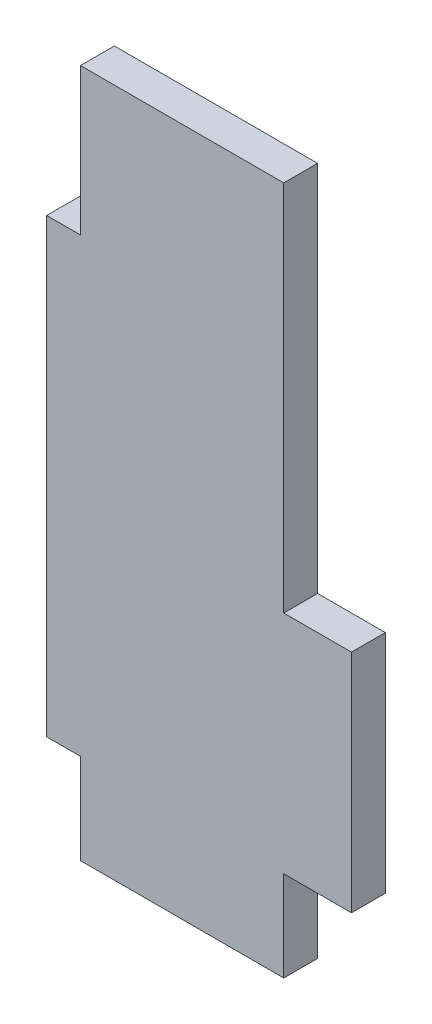
ISO-10303-21;
HEADER;
FILE_DESCRIPTION(('STEP AP214'),'2;1');
FILE_NAME('part.step','',(''),(''),'','','');
FILE_SCHEMA(('AUTOMOTIVE_DESIGN { 1 0 10303 214 1 1 1 1 }'));
ENDSEC;
DATA;
#1=APPLICATION_CONTEXT('core data for automotive mechanical design processes');
#2=APPLICATION_PROTOCOL_DEFINITION('international standard','automotive_design',2000,#1);
#3=PRODUCT_CONTEXT('',#1,'mechanical');
#4=PRODUCT('Part','Part','',(#3));
#5=PRODUCT_RELATED_PRODUCT_CATEGORY('part','',(#4));
#6=PRODUCT_DEFINITION_FORMATION('','',#4);
#7=PRODUCT_DEFINITION_CONTEXT('part definition',#1,'design');
#8=PRODUCT_DEFINITION('design','',#6,#7);
#9=PRODUCT_DEFINITION_SHAPE('','',#8);
#10=(LENGTH_UNIT() NAMED_UNIT(*) SI_UNIT(.MILLI.,.METRE.));
#11=(NAMED_UNIT(*) PLANE_ANGLE_UNIT() SI_UNIT($,.RADIAN.));
#12=(NAMED_UNIT(*) SI_UNIT($,.STERADIAN.) SOLID_ANGLE_UNIT());
#13=UNCERTAINTY_MEASURE_WITH_UNIT(LENGTH_MEASURE(1.E-05),#10,'distance_accuracy_value','');
#14=(GEOMETRIC_REPRESENTATION_CONTEXT(3) GLOBAL_UNCERTAINTY_ASSIGNED_CONTEXT((#13)) GLOBAL_UNIT_ASSIGNED_CONTEXT((#10,
#11,#12)) REPRESENTATION_CONTEXT('',''));
#15=CARTESIAN_POINT('',(0.,0.,0.));
#16=DIRECTION('',(0.,0.,1.));
#17=DIRECTION('',(1.,0.,0.));
#18=AXIS2_PLACEMENT_3D('',#15,#16,#17);
#19=CARTESIAN_POINT('',(-18.,61.,3.));
#20=DIRECTION('',(1.,0.,0.));
#21=DIRECTION('',(0.,1.,0.));
#22=AXIS2_PLACEMENT_3D('',#19,#20,#21);
#23=PLANE('',#22);
#24=DIRECTION('',(0.,0.,1.));
#25=VECTOR('',#24,1.);
#26=CARTESIAN_POINT('',(-18.,8.,-40.1123422402632));
#27=LINE('',#26,#25);
#28=CARTESIAN_POINT('',(-18.,8.00000000000001,0.));
#29=VERTEX_POINT('',#28);
#30=CARTESIAN_POINT('',(-18.,8.,3.));
#31=VERTEX_POINT('',#30);
#32=EDGE_CURVE('E58',#29,#31,#27,.T.);
#33=ORIENTED_EDGE('',*,*,#32,.F.);
#34=DIRECTION('',(0.,-1.,0.));
#35=VECTOR('',#34,1.);
#36=CARTESIAN_POINT('',(-18.,61.,0.));
#37=LINE('',#36,#35);
#38=CARTESIAN_POINT('',(-18.,0.,0.));
#39=VERTEX_POINT('',#38);
#40=EDGE_CURVE('E183',#29,#39,#37,.T.);
#41=ORIENTED_EDGE('',*,*,#40,.T.);
#42=DIRECTION('',(0.,0.,-1.));
#43=VECTOR('',#42,1.);
#44=CARTESIAN_POINT('',(-18.,0.,3.));
#45=LINE('',#44,#43);
#46=CARTESIAN_POINT('',(-18.,0.,3.));
#47=VERTEX_POINT('',#46);
#48=EDGE_CURVE('E11',#47,#39,#45,.T.);
#49=ORIENTED_EDGE('',*,*,#48,.F.);
#50=DIRECTION('',(0.,-1.,0.));
#51=VECTOR('',#50,1.);
#52=CARTESIAN_POINT('',(-18.,61.,3.));
#53=LINE('',#52,#51);
#54=EDGE_CURVE('E187',#31,#47,#53,.T.);
#55=ORIENTED_EDGE('',*,*,#54,.F.);
#56=EDGE_LOOP('',(#33,#41,#49,#55));
#57=FACE_BOUND('',#56,.T.);
#58=ADVANCED_FACE('F35',(#57),#23,.F.);
#59=CARTESIAN_POINT('',(0.,61.,3.));
#60=DIRECTION('',(-1.,0.,0.));
#61=DIRECTION('',(0.,0.,1.));
#62=AXIS2_PLACEMENT_3D('',#59,#60,#61);
#63=PLANE('',#62);
#64=DIRECTION('',(0.,0.,1.));
#65=VECTOR('',#64,1.);
#66=CARTESIAN_POINT('',(0.,28.,-40.1123422402632));
#67=LINE('',#66,#65);
#68=CARTESIAN_POINT('',(0.,28.,0.));
#69=VERTEX_POINT('',#68);
#70=CARTESIAN_POINT('',(0.,28.,3.));
#71=VERTEX_POINT('',#70);
#72=EDGE_CURVE('E177',#69,#71,#67,.T.);
#73=ORIENTED_EDGE('',*,*,#72,.F.);
#74=DIRECTION('',(0.,1.,0.));
#75=VECTOR('',#74,1.);
#76=CARTESIAN_POINT('',(0.,61.,0.));
#77=LINE('',#76,#75);
#78=CARTESIAN_POINT('',(0.,61.,0.));
#79=VERTEX_POINT('',#78);
#80=EDGE_CURVE('E200',#69,#79,#77,.T.);
#81=ORIENTED_EDGE('',*,*,#80,.T.);
#82=DIRECTION('',(0.,0.,-1.));
#83=VECTOR('',#82,1.);
#84=CARTESIAN_POINT('',(0.,61.,3.));
#85=LINE('',#84,#83);
#86=CARTESIAN_POINT('',(0.,61.,3.));
#87=VERTEX_POINT('',#86);
#88=EDGE_CURVE('E208',#87,#79,#85,.T.);
#89=ORIENTED_EDGE('',*,*,#88,.F.);
#90=DIRECTION('',(0.,1.,0.));
#91=VECTOR('',#90,1.);
#92=CARTESIAN_POINT('',(0.,61.,3.));
#93=LINE('',#92,#91);
#94=EDGE_CURVE('E189',#71,#87,#93,.T.);
#95=ORIENTED_EDGE('',*,*,#94,.F.);
#96=EDGE_LOOP('',(#73,#81,#89,#95));
#97=FACE_BOUND('',#96,.T.);
#98=ADVANCED_FACE('F242',(#97),#63,.F.);
#99=CARTESIAN_POINT('',(-18.,61.,0.));
#100=VERTEX_POINT('',#99);
#101=CARTESIAN_POINT('',(-18.,48.,0.));
#102=VERTEX_POINT('',#101);
#103=EDGE_CURVE('E196',#100,#102,#37,.T.);
#104=ORIENTED_EDGE('',*,*,#103,.T.);
#105=DIRECTION('',(0.,0.,1.));
#106=VECTOR('',#105,1.);
#107=CARTESIAN_POINT('',(-18.,48.,-40.1123422402632));
#108=LINE('',#107,#106);
#109=CARTESIAN_POINT('',(-18.,48.,3.));
#110=VERTEX_POINT('',#109);
#111=EDGE_CURVE('E50',#102,#110,#108,.T.);
#112=ORIENTED_EDGE('',*,*,#111,.T.);
#113=CARTESIAN_POINT('',(-18.,61.,3.));
#114=VERTEX_POINT('',#113);
#115=EDGE_CURVE('E184',#114,#110,#53,.T.);
#116=ORIENTED_EDGE('',*,*,#115,.F.);
#117=DIRECTION('',(0.,0.,-1.));
#118=VECTOR('',#117,1.);
#119=CARTESIAN_POINT('',(-18.,61.,3.));
#120=LINE('',#119,#118);
#121=EDGE_CURVE('E195',#114,#100,#120,.T.);
#122=ORIENTED_EDGE('',*,*,#121,.T.);
#123=EDGE_LOOP('',(#104,#112,#116,#122));
#124=FACE_BOUND('',#123,.T.);
#125=ADVANCED_FACE('F37',(#124),#23,.F.);
#126=CARTESIAN_POINT('',(-18.,0.,3.));
#127=DIRECTION('',(0.,1.,0.));
#128=DIRECTION('',(0.,0.,1.));
#129=AXIS2_PLACEMENT_3D('',#126,#127,#128);
#130=PLANE('',#129);
#131=DIRECTION('',(1.,0.,0.));
#132=VECTOR('',#131,1.);
#133=CARTESIAN_POINT('',(-18.,0.,0.));
#134=LINE('',#133,#132);
#135=CARTESIAN_POINT('',(0.,0.,0.));
#136=VERTEX_POINT('',#135);
#137=EDGE_CURVE('E198',#39,#136,#134,.T.);
#138=ORIENTED_EDGE('',*,*,#137,.T.);
#139=DIRECTION('',(0.,0.,-1.));
#140=VECTOR('',#139,1.);
#141=CARTESIAN_POINT('',(0.,0.,3.));
#142=LINE('',#141,#140);
#143=CARTESIAN_POINT('',(0.,0.,3.));
#144=VERTEX_POINT('',#143);
#145=EDGE_CURVE('E43',#144,#136,#142,.T.);
#146=ORIENTED_EDGE('',*,*,#145,.F.);
#147=DIRECTION('',(1.,0.,0.));
#148=VECTOR('',#147,1.);
#149=CARTESIAN_POINT('',(-18.,0.,3.));
#150=LINE('',#149,#148);
#151=EDGE_CURVE('E186',#47,#144,#150,.T.);
#152=ORIENTED_EDGE('',*,*,#151,.F.);
#153=ORIENTED_EDGE('',*,*,#48,.T.);
#154=EDGE_LOOP('',(#138,#146,#152,#153));
#155=FACE_BOUND('',#154,.T.);
#156=ADVANCED_FACE('F229',(#155),#130,.F.);
#157=CARTESIAN_POINT('',(0.,8.,0.));
#158=VERTEX_POINT('',#157);
#159=EDGE_CURVE('E201',#136,#158,#77,.T.);
#160=ORIENTED_EDGE('',*,*,#159,.T.);
#161=DIRECTION('',(0.,0.,1.));
#162=VECTOR('',#161,1.);
#163=CARTESIAN_POINT('',(0.,8.,-40.1123422402632));
#164=LINE('',#163,#162);
#165=CARTESIAN_POINT('',(0.,8.00000000000001,3.));
#166=VERTEX_POINT('',#165);
#167=EDGE_CURVE('E163',#158,#166,#164,.T.);
#168=ORIENTED_EDGE('',*,*,#167,.T.);
#169=EDGE_CURVE('E190',#144,#166,#93,.T.);
#170=ORIENTED_EDGE('',*,*,#169,.F.);
#171=ORIENTED_EDGE('',*,*,#145,.T.);
#172=EDGE_LOOP('',(#160,#168,#170,#171));
#173=FACE_BOUND('',#172,.T.);
#174=ADVANCED_FACE('F215',(#173),#63,.F.);
#175=CARTESIAN_POINT('',(-18.,61.,3.));
#176=DIRECTION('',(0.,-1.,0.));
#177=DIRECTION('',(0.,0.,-1.));
#178=AXIS2_PLACEMENT_3D('',#175,#176,#177);
#179=PLANE('',#178);
#180=DIRECTION('',(-1.,0.,0.));
#181=VECTOR('',#180,1.);
#182=CARTESIAN_POINT('',(-18.,61.,0.));
#183=LINE('',#182,#181);
#184=EDGE_CURVE('E204',#79,#100,#183,.T.);
#185=ORIENTED_EDGE('',*,*,#184,.T.);
#186=ORIENTED_EDGE('',*,*,#121,.F.);
#187=DIRECTION('',(-1.,0.,0.));
#188=VECTOR('',#187,1.);
#189=CARTESIAN_POINT('',(-18.,61.,3.));
#190=LINE('',#189,#188);
#191=EDGE_CURVE('E193',#87,#114,#190,.T.);
#192=ORIENTED_EDGE('',*,*,#191,.F.);
#193=ORIENTED_EDGE('',*,*,#88,.T.);
#194=EDGE_LOOP('',(#185,#186,#192,#193));
#195=FACE_BOUND('',#194,.T.);
#196=ADVANCED_FACE('F237',(#195),#179,.F.);
#197=CARTESIAN_POINT('',(0.,0.,3.));
#198=DIRECTION('',(0.,0.,1.));
#199=DIRECTION('',(1.,0.,0.));
#200=AXIS2_PLACEMENT_3D('',#197,#198,#199);
#201=PLANE('',#200);
#202=ORIENTED_EDGE('',*,*,#115,.T.);
#203=DIRECTION('',(-1.,0.,0.));
#204=VECTOR('',#203,1.);
#205=CARTESIAN_POINT('',(-18.,48.,3.));
#206=LINE('',#205,#204);
#207=CARTESIAN_POINT('',(-21.,48.,3.));
#208=VERTEX_POINT('',#207);
#209=EDGE_CURVE('E152',#110,#208,#206,.T.);
#210=ORIENTED_EDGE('',*,*,#209,.T.);
#211=DIRECTION('',(0.,1.,0.));
#212=VECTOR('',#211,1.);
#213=CARTESIAN_POINT('',(-21.,8.,3.));
#214=LINE('',#213,#212);
#215=CARTESIAN_POINT('',(-21.,8.,3.));
#216=VERTEX_POINT('',#215);
#217=EDGE_CURVE('E145',#216,#208,#214,.T.);
#218=ORIENTED_EDGE('',*,*,#217,.F.);
#219=DIRECTION('',(-1.,0.,0.));
#220=VECTOR('',#219,1.);
#221=CARTESIAN_POINT('',(-18.,8.,3.));
#222=LINE('',#221,#220);
#223=EDGE_CURVE('E155',#31,#216,#222,.T.);
#224=ORIENTED_EDGE('',*,*,#223,.F.);
#225=ORIENTED_EDGE('',*,*,#54,.T.);
#226=ORIENTED_EDGE('',*,*,#151,.T.);
#227=ORIENTED_EDGE('',*,*,#169,.T.);
#228=DIRECTION('',(1.,0.,0.));
#229=VECTOR('',#228,1.);
#230=CARTESIAN_POINT('',(0.,8.,3.));
#231=LINE('',#230,#229);
#232=CARTESIAN_POINT('',(6.,8.,3.));
#233=VERTEX_POINT('',#232);
#234=EDGE_CURVE('E158',#166,#233,#231,.T.);
#235=ORIENTED_EDGE('',*,*,#234,.T.);
#236=DIRECTION('',(0.,1.,0.));
#237=VECTOR('',#236,1.);
#238=CARTESIAN_POINT('',(6.,0.,3.));
#239=LINE('',#238,#237);
#240=CARTESIAN_POINT('',(6.,28.,3.));
#241=VERTEX_POINT('',#240);
#242=EDGE_CURVE('E168',#233,#241,#239,.T.);
#243=ORIENTED_EDGE('',*,*,#242,.T.);
#244=DIRECTION('',(1.,0.,0.));
#245=VECTOR('',#244,1.);
#246=CARTESIAN_POINT('',(0.,28.,3.));
#247=LINE('',#246,#245);
#248=EDGE_CURVE('E171',#71,#241,#247,.T.);
#249=ORIENTED_EDGE('',*,*,#248,.F.);
#250=ORIENTED_EDGE('',*,*,#94,.T.);
#251=ORIENTED_EDGE('',*,*,#191,.T.);
#252=EDGE_LOOP('',(#202,#210,#218,#224,#225,#226,#227,#235,#243,#249,#250,#251));
#253=FACE_BOUND('',#252,.T.);
#254=ADVANCED_FACE('F226',(#253),#201,.T.);
#255=CARTESIAN_POINT('',(0.,0.,0.));
#256=DIRECTION('',(0.,0.,1.));
#257=DIRECTION('',(1.,0.,0.));
#258=AXIS2_PLACEMENT_3D('',#255,#256,#257);
#259=PLANE('',#258);
#260=ORIENTED_EDGE('',*,*,#103,.F.);
#261=ORIENTED_EDGE('',*,*,#184,.F.);
#262=ORIENTED_EDGE('',*,*,#80,.F.);
#263=DIRECTION('',(-1.,0.,0.));
#264=VECTOR('',#263,1.);
#265=CARTESIAN_POINT('',(0.,28.,0.));
#266=LINE('',#265,#264);
#267=CARTESIAN_POINT('',(6.,28.,0.));
#268=VERTEX_POINT('',#267);
#269=EDGE_CURVE('E160',#268,#69,#266,.T.);
#270=ORIENTED_EDGE('',*,*,#269,.F.);
#271=DIRECTION('',(0.,-1.,0.));
#272=VECTOR('',#271,1.);
#273=CARTESIAN_POINT('',(6.,0.,0.));
#274=LINE('',#273,#272);
#275=CARTESIAN_POINT('',(6.,8.,0.));
#276=VERTEX_POINT('',#275);
#277=EDGE_CURVE('E165',#268,#276,#274,.T.);
#278=ORIENTED_EDGE('',*,*,#277,.T.);
#279=DIRECTION('',(-1.,0.,0.));
#280=VECTOR('',#279,1.);
#281=CARTESIAN_POINT('',(0.,8.,0.));
#282=LINE('',#281,#280);
#283=EDGE_CURVE('E162',#276,#158,#282,.T.);
#284=ORIENTED_EDGE('',*,*,#283,.T.);
#285=ORIENTED_EDGE('',*,*,#159,.F.);
#286=ORIENTED_EDGE('',*,*,#137,.F.);
#287=ORIENTED_EDGE('',*,*,#40,.F.);
#288=DIRECTION('',(1.,0.,0.));
#289=VECTOR('',#288,1.);
#290=CARTESIAN_POINT('',(-18.,8.,0.));
#291=LINE('',#290,#289);
#292=CARTESIAN_POINT('',(-21.,8.,0.));
#293=VERTEX_POINT('',#292);
#294=EDGE_CURVE('E131',#293,#29,#291,.T.);
#295=ORIENTED_EDGE('',*,*,#294,.F.);
#296=DIRECTION('',(0.,-1.,0.));
#297=VECTOR('',#296,1.);
#298=CARTESIAN_POINT('',(-21.,8.,0.));
#299=LINE('',#298,#297);
#300=CARTESIAN_POINT('',(-21.,48.,0.));
#301=VERTEX_POINT('',#300);
#302=EDGE_CURVE('E125',#301,#293,#299,.T.);
#303=ORIENTED_EDGE('',*,*,#302,.F.);
#304=DIRECTION('',(1.,0.,0.));
#305=VECTOR('',#304,1.);
#306=CARTESIAN_POINT('',(-18.,48.,0.));
#307=LINE('',#306,#305);
#308=EDGE_CURVE('E129',#301,#102,#307,.T.);
#309=ORIENTED_EDGE('',*,*,#308,.T.);
#310=EDGE_LOOP('',(#260,#261,#262,#270,#278,#284,#285,#286,#287,#295,#303,#309));
#311=FACE_BOUND('',#310,.T.);
#312=ADVANCED_FACE('F128',(#311),#259,.F.);
#313=CARTESIAN_POINT('',(0.,8.,-40.1123422402632));
#314=DIRECTION('',(0.,-1.,0.));
#315=DIRECTION('',(0.,0.,-1.));
#316=AXIS2_PLACEMENT_3D('',#313,#314,#315);
#317=PLANE('',#316);
#318=ORIENTED_EDGE('',*,*,#283,.F.);
#319=DIRECTION('',(0.,0.,1.));
#320=VECTOR('',#319,1.);
#321=CARTESIAN_POINT('',(6.,8.,-40.1123422402632));
#322=LINE('',#321,#320);
#323=EDGE_CURVE('E174',#276,#233,#322,.T.);
#324=ORIENTED_EDGE('',*,*,#323,.T.);
#325=ORIENTED_EDGE('',*,*,#234,.F.);
#326=ORIENTED_EDGE('',*,*,#167,.F.);
#327=EDGE_LOOP('',(#318,#324,#325,#326));
#328=FACE_BOUND('',#327,.T.);
#329=ADVANCED_FACE('F224',(#328),#317,.T.);
#330=CARTESIAN_POINT('',(0.,28.,-40.1123422402632));
#331=DIRECTION('',(0.,-1.,0.));
#332=DIRECTION('',(0.,0.,-1.));
#333=AXIS2_PLACEMENT_3D('',#330,#331,#332);
#334=PLANE('',#333);
#335=DIRECTION('',(0.,0.,1.));
#336=VECTOR('',#335,1.);
#337=CARTESIAN_POINT('',(6.,28.,-40.1123422402632));
#338=LINE('',#337,#336);
#339=EDGE_CURVE('E179',#268,#241,#338,.T.);
#340=ORIENTED_EDGE('',*,*,#339,.F.);
#341=ORIENTED_EDGE('',*,*,#269,.T.);
#342=ORIENTED_EDGE('',*,*,#72,.T.);
#343=ORIENTED_EDGE('',*,*,#248,.T.);
#344=EDGE_LOOP('',(#340,#341,#342,#343));
#345=FACE_BOUND('',#344,.T.);
#346=ADVANCED_FACE('F246',(#345),#334,.F.);
#347=CARTESIAN_POINT('',(6.,0.,-40.1123422402632));
#348=DIRECTION('',(1.,0.,0.));
#349=DIRECTION('',(0.,0.,-1.));
#350=AXIS2_PLACEMENT_3D('',#347,#348,#349);
#351=PLANE('',#350);
#352=ORIENTED_EDGE('',*,*,#277,.F.);
#353=ORIENTED_EDGE('',*,*,#339,.T.);
#354=ORIENTED_EDGE('',*,*,#242,.F.);
#355=ORIENTED_EDGE('',*,*,#323,.F.);
#356=EDGE_LOOP('',(#352,#353,#354,#355));
#357=FACE_BOUND('',#356,.T.);
#358=ADVANCED_FACE('F249',(#357),#351,.T.);
#359=CARTESIAN_POINT('',(-18.,8.,-40.1123422402632));
#360=DIRECTION('',(0.,1.,0.));
#361=DIRECTION('',(0.,0.,1.));
#362=AXIS2_PLACEMENT_3D('',#359,#360,#361);
#363=PLANE('',#362);
#364=DIRECTION('',(0.,0.,1.));
#365=VECTOR('',#364,1.);
#366=CARTESIAN_POINT('',(-21.,8.,-40.1123422402632));
#367=LINE('',#366,#365);
#368=EDGE_CURVE('E141',#293,#216,#367,.T.);
#369=ORIENTED_EDGE('',*,*,#368,.F.);
#370=ORIENTED_EDGE('',*,*,#294,.T.);
#371=ORIENTED_EDGE('',*,*,#32,.T.);
#372=ORIENTED_EDGE('',*,*,#223,.T.);
#373=EDGE_LOOP('',(#369,#370,#371,#372));
#374=FACE_BOUND('',#373,.T.);
#375=ADVANCED_FACE('F231',(#374),#363,.F.);
#376=CARTESIAN_POINT('',(-21.,8.,-40.1123422402632));
#377=DIRECTION('',(1.,0.,0.));
#378=DIRECTION('',(0.,0.,-1.));
#379=AXIS2_PLACEMENT_3D('',#376,#377,#378);
#380=PLANE('',#379);
#381=DIRECTION('',(0.,0.,1.));
#382=VECTOR('',#381,1.);
#383=CARTESIAN_POINT('',(-21.,48.,-40.1123422402632));
#384=LINE('',#383,#382);
#385=EDGE_CURVE('E139',#301,#208,#384,.T.);
#386=ORIENTED_EDGE('',*,*,#385,.F.);
#387=ORIENTED_EDGE('',*,*,#302,.T.);
#388=ORIENTED_EDGE('',*,*,#368,.T.);
#389=ORIENTED_EDGE('',*,*,#217,.T.);
#390=EDGE_LOOP('',(#386,#387,#388,#389));
#391=FACE_BOUND('',#390,.T.);
#392=ADVANCED_FACE('F143',(#391),#380,.F.);
#393=CARTESIAN_POINT('',(-18.,48.,-40.1123422402632));
#394=DIRECTION('',(0.,1.,0.));
#395=DIRECTION('',(0.,0.,1.));
#396=AXIS2_PLACEMENT_3D('',#393,#394,#395);
#397=PLANE('',#396);
#398=ORIENTED_EDGE('',*,*,#308,.F.);
#399=ORIENTED_EDGE('',*,*,#385,.T.);
#400=ORIENTED_EDGE('',*,*,#209,.F.);
#401=ORIENTED_EDGE('',*,*,#111,.F.);
#402=EDGE_LOOP('',(#398,#399,#400,#401));
#403=FACE_BOUND('',#402,.T.);
#404=ADVANCED_FACE('F137',(#403),#397,.T.);
#405=CLOSED_SHELL('',(#58,#98,#125,#156,#174,#196,#254,#312,#329,#346,#358,#375,#392,#404));
#406=MANIFOLD_SOLID_BREP('B2',#405);
#407=ADVANCED_BREP_SHAPE_REPRESENTATION('',(#18,#406),#14);
#408=SHAPE_DEFINITION_REPRESENTATION(#9,#407);
ENDSEC;
END-ISO-10303-21;
